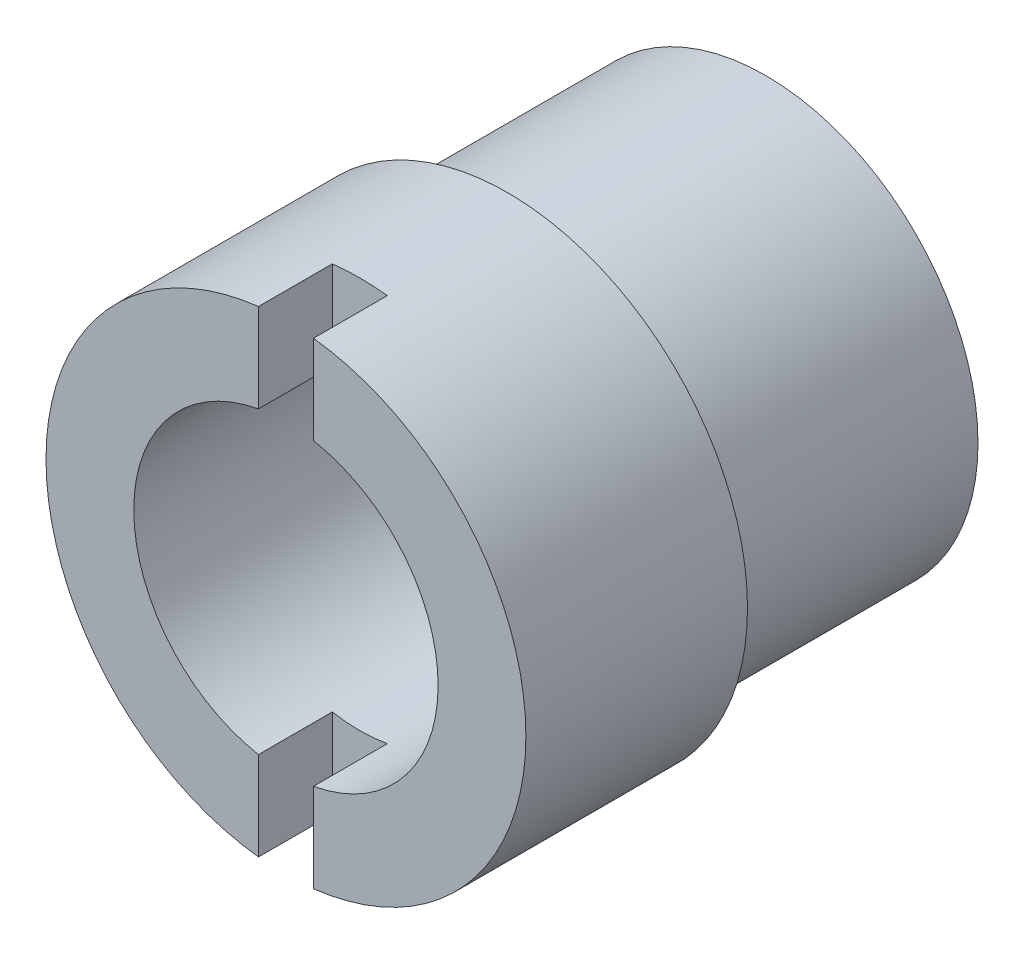
ISO-10303-21;
HEADER;
FILE_DESCRIPTION(('STEP AP214'),'2;1');
FILE_NAME('part.step','',(''),(''),'','','');
FILE_SCHEMA(('AUTOMOTIVE_DESIGN { 1 0 10303 214 1 1 1 1 }'));
ENDSEC;
DATA;
#1=APPLICATION_CONTEXT('core data for automotive mechanical design processes');
#2=APPLICATION_PROTOCOL_DEFINITION('international standard','automotive_design',2000,#1);
#3=PRODUCT_CONTEXT('',#1,'mechanical');
#4=PRODUCT('Part','Part','',(#3));
#5=PRODUCT_RELATED_PRODUCT_CATEGORY('part','',(#4));
#6=PRODUCT_DEFINITION_FORMATION('','',#4);
#7=PRODUCT_DEFINITION_CONTEXT('part definition',#1,'design');
#8=PRODUCT_DEFINITION('design','',#6,#7);
#9=PRODUCT_DEFINITION_SHAPE('','',#8);
#10=(LENGTH_UNIT() NAMED_UNIT(*) SI_UNIT(.MILLI.,.METRE.));
#11=(NAMED_UNIT(*) PLANE_ANGLE_UNIT() SI_UNIT($,.RADIAN.));
#12=(NAMED_UNIT(*) SI_UNIT($,.STERADIAN.) SOLID_ANGLE_UNIT());
#13=UNCERTAINTY_MEASURE_WITH_UNIT(LENGTH_MEASURE(1.E-05),#10,'distance_accuracy_value','');
#14=(GEOMETRIC_REPRESENTATION_CONTEXT(3) GLOBAL_UNCERTAINTY_ASSIGNED_CONTEXT((#13)) GLOBAL_UNIT_ASSIGNED_CONTEXT((#10,
#11,#12)) REPRESENTATION_CONTEXT('',''));
#15=CARTESIAN_POINT('',(0.,0.,0.));
#16=DIRECTION('',(0.,0.,1.));
#17=DIRECTION('',(1.,0.,0.));
#18=AXIS2_PLACEMENT_3D('',#15,#16,#17);
#19=CARTESIAN_POINT('',(0.,0.,9.525));
#20=DIRECTION('',(0.,0.,1.));
#21=DIRECTION('',(1.,0.,0.));
#22=AXIS2_PLACEMENT_3D('',#19,#20,#21);
#23=PLANE('',#22);
#24=DIRECTION('',(0.,1.,0.));
#25=VECTOR('',#24,1.);
#26=CARTESIAN_POINT('',(-1.1811,-10.3124,9.525));
#27=LINE('',#26,#25);
#28=CARTESIAN_POINT('',(-1.1811,6.43297311046766,9.525));
#29=VERTEX_POINT('',#28);
#30=CARTESIAN_POINT('',(-1.1811,10.2445398408128,9.525));
#31=VERTEX_POINT('',#30);
#32=EDGE_CURVE('E328',#29,#31,#27,.T.);
#33=ORIENTED_EDGE('',*,*,#32,.T.);
#34=CARTESIAN_POINT('',(0.,0.,9.525));
#35=DIRECTION('',(0.,0.,1.));
#36=DIRECTION('',(1.,0.,0.));
#37=AXIS2_PLACEMENT_3D('',#34,#35,#36);
#38=CIRCLE('',#37,10.3124);
#39=CARTESIAN_POINT('',(-1.1811,-10.2445398408128,9.525));
#40=VERTEX_POINT('',#39);
#41=EDGE_CURVE('E133',#31,#40,#38,.T.);
#42=ORIENTED_EDGE('',*,*,#41,.T.);
#43=CARTESIAN_POINT('',(-1.1811,-6.43297311046766,9.525));
#44=VERTEX_POINT('',#43);
#45=EDGE_CURVE('E326',#40,#44,#27,.T.);
#46=ORIENTED_EDGE('',*,*,#45,.T.);
#47=CARTESIAN_POINT('',(0.,0.,9.525));
#48=DIRECTION('',(0.,0.,1.));
#49=DIRECTION('',(1.,0.,0.));
#50=AXIS2_PLACEMENT_3D('',#47,#48,#49);
#51=CIRCLE('',#50,6.5405);
#52=EDGE_CURVE('E141',#29,#44,#51,.T.);
#53=ORIENTED_EDGE('',*,*,#52,.F.);
#54=EDGE_LOOP('',(#33,#42,#46,#53));
#55=FACE_BOUND('',#54,.T.);
#56=ADVANCED_FACE('F43',(#55),#23,.T.);
#57=DIRECTION('',(0.,1.,0.));
#58=VECTOR('',#57,1.);
#59=CARTESIAN_POINT('',(1.1811,-10.3124,9.525));
#60=LINE('',#59,#58);
#61=CARTESIAN_POINT('',(1.1811,-10.2445398408128,9.525));
#62=VERTEX_POINT('',#61);
#63=CARTESIAN_POINT('',(1.1811,-6.43297311046766,9.525));
#64=VERTEX_POINT('',#63);
#65=EDGE_CURVE('E67',#62,#64,#60,.T.);
#66=ORIENTED_EDGE('',*,*,#65,.F.);
#67=CARTESIAN_POINT('',(1.1811,10.2445398408128,9.525));
#68=VERTEX_POINT('',#67);
#69=EDGE_CURVE('E123',#62,#68,#38,.T.);
#70=ORIENTED_EDGE('',*,*,#69,.T.);
#71=CARTESIAN_POINT('',(1.1811,6.43297311046766,9.525));
#72=VERTEX_POINT('',#71);
#73=EDGE_CURVE('E127',#72,#68,#60,.T.);
#74=ORIENTED_EDGE('',*,*,#73,.F.);
#75=EDGE_CURVE('E125',#64,#72,#51,.T.);
#76=ORIENTED_EDGE('',*,*,#75,.F.);
#77=EDGE_LOOP('',(#66,#70,#74,#76));
#78=FACE_BOUND('',#77,.T.);
#79=ADVANCED_FACE('F121',(#78),#23,.T.);
#80=CARTESIAN_POINT('',(0.,0.,0.));
#81=DIRECTION('',(0.,0.,1.));
#82=DIRECTION('',(1.,0.,0.));
#83=AXIS2_PLACEMENT_3D('',#80,#81,#82);
#84=PLANE('',#83);
#85=CARTESIAN_POINT('',(0.,0.,0.));
#86=DIRECTION('',(0.,0.,-1.));
#87=DIRECTION('',(-1.,0.,0.));
#88=AXIS2_PLACEMENT_3D('',#85,#86,#87);
#89=CIRCLE('',#88,9.1186);
#90=CARTESIAN_POINT('',(-9.1186,0.,0.));
#91=VERTEX_POINT('',#90);
#92=EDGE_CURVE('E139',#91,#91,#89,.T.);
#93=ORIENTED_EDGE('',*,*,#92,.F.);
#94=EDGE_LOOP('',(#93));
#95=FACE_BOUND('',#94,.T.);
#96=CARTESIAN_POINT('',(0.,0.,0.));
#97=DIRECTION('',(0.,0.,1.));
#98=DIRECTION('',(1.,0.,0.));
#99=AXIS2_PLACEMENT_3D('',#96,#97,#98);
#100=CIRCLE('',#99,10.3124);
#101=CARTESIAN_POINT('',(10.3124,0.,0.));
#102=VERTEX_POINT('',#101);
#103=EDGE_CURVE('E134',#102,#102,#100,.T.);
#104=ORIENTED_EDGE('',*,*,#103,.F.);
#105=EDGE_LOOP('',(#104));
#106=FACE_BOUND('',#105,.T.);
#107=ADVANCED_FACE('F203',(#95,#106),#84,.F.);
#108=CARTESIAN_POINT('',(0.,0.,9.525));
#109=DIRECTION('',(0.,0.,-1.));
#110=DIRECTION('',(-1.,0.,0.));
#111=AXIS2_PLACEMENT_3D('',#108,#109,#110);
#112=CYLINDRICAL_SURFACE('',#111,10.3124);
#113=ORIENTED_EDGE('',*,*,#41,.F.);
#114=DIRECTION('',(0.,0.,-1.));
#115=VECTOR('',#114,1.);
#116=CARTESIAN_POINT('',(-1.1811,10.2445398408128,9.525));
#117=LINE('',#116,#115);
#118=CARTESIAN_POINT('',(-1.1811,10.2445398408128,6.35));
#119=VERTEX_POINT('',#118);
#120=EDGE_CURVE('E194',#31,#119,#117,.T.);
#121=ORIENTED_EDGE('',*,*,#120,.T.);
#122=CARTESIAN_POINT('',(0.,0.,6.35));
#123=DIRECTION('',(0.,0.,-1.));
#124=DIRECTION('',(-1.,0.,0.));
#125=AXIS2_PLACEMENT_3D('',#122,#123,#124);
#126=CIRCLE('',#125,10.3124);
#127=CARTESIAN_POINT('',(1.1811,10.2445398408128,6.35));
#128=VERTEX_POINT('',#127);
#129=EDGE_CURVE('E322',#119,#128,#126,.T.);
#130=ORIENTED_EDGE('',*,*,#129,.T.);
#131=DIRECTION('',(0.,0.,-1.));
#132=VECTOR('',#131,1.);
#133=CARTESIAN_POINT('',(1.1811,10.2445398408128,9.525));
#134=LINE('',#133,#132);
#135=EDGE_CURVE('E116',#128,#68,#134,.F.);
#136=ORIENTED_EDGE('',*,*,#135,.T.);
#137=ORIENTED_EDGE('',*,*,#69,.F.);
#138=DIRECTION('',(0.,0.,-1.));
#139=VECTOR('',#138,1.);
#140=CARTESIAN_POINT('',(1.1811,-10.2445398408128,9.525));
#141=LINE('',#140,#139);
#142=CARTESIAN_POINT('',(1.1811,-10.2445398408128,6.35));
#143=VERTEX_POINT('',#142);
#144=EDGE_CURVE('E108',#62,#143,#141,.T.);
#145=ORIENTED_EDGE('',*,*,#144,.T.);
#146=CARTESIAN_POINT('',(-1.1811,-10.2445398408128,6.35));
#147=VERTEX_POINT('',#146);
#148=EDGE_CURVE('E115',#143,#147,#126,.T.);
#149=ORIENTED_EDGE('',*,*,#148,.T.);
#150=DIRECTION('',(0.,0.,-1.));
#151=VECTOR('',#150,1.);
#152=CARTESIAN_POINT('',(-1.1811,-10.2445398408128,9.525));
#153=LINE('',#152,#151);
#154=EDGE_CURVE('E170',#147,#40,#153,.F.);
#155=ORIENTED_EDGE('',*,*,#154,.T.);
#156=EDGE_LOOP('',(#113,#121,#130,#136,#137,#145,#149,#155));
#157=FACE_BOUND('',#156,.T.);
#158=ORIENTED_EDGE('',*,*,#103,.T.);
#159=EDGE_LOOP('',(#158));
#160=FACE_BOUND('',#159,.T.);
#161=ADVANCED_FACE('F45',(#157,#160),#112,.T.);
#162=CARTESIAN_POINT('',(0.,0.,9.525));
#163=DIRECTION('',(0.,0.,-1.));
#164=DIRECTION('',(-1.,0.,0.));
#165=AXIS2_PLACEMENT_3D('',#162,#163,#164);
#166=CYLINDRICAL_SURFACE('',#165,6.5405);
#167=DIRECTION('',(0.,0.,-1.));
#168=VECTOR('',#167,1.);
#169=CARTESIAN_POINT('',(-1.1811,-6.43297311046766,9.525));
#170=LINE('',#169,#168);
#171=CARTESIAN_POINT('',(-1.1811,-6.43297311046766,6.35));
#172=VERTEX_POINT('',#171);
#173=EDGE_CURVE('E11',#172,#44,#170,.F.);
#174=ORIENTED_EDGE('',*,*,#173,.F.);
#175=CARTESIAN_POINT('',(0.,0.,6.35));
#176=DIRECTION('',(0.,0.,-1.));
#177=DIRECTION('',(-1.,0.,0.));
#178=AXIS2_PLACEMENT_3D('',#175,#176,#177);
#179=CIRCLE('',#178,6.5405);
#180=CARTESIAN_POINT('',(1.1811,-6.43297311046766,6.35));
#181=VERTEX_POINT('',#180);
#182=EDGE_CURVE('E52',#181,#172,#179,.T.);
#183=ORIENTED_EDGE('',*,*,#182,.F.);
#184=DIRECTION('',(0.,0.,-1.));
#185=VECTOR('',#184,1.);
#186=CARTESIAN_POINT('',(1.1811,-6.43297311046766,9.525));
#187=LINE('',#186,#185);
#188=EDGE_CURVE('E154',#64,#181,#187,.T.);
#189=ORIENTED_EDGE('',*,*,#188,.F.);
#190=ORIENTED_EDGE('',*,*,#75,.T.);
#191=DIRECTION('',(0.,0.,-1.));
#192=VECTOR('',#191,1.);
#193=CARTESIAN_POINT('',(1.1811,6.43297311046766,9.525));
#194=LINE('',#193,#192);
#195=CARTESIAN_POINT('',(1.1811,6.43297311046766,6.35));
#196=VERTEX_POINT('',#195);
#197=EDGE_CURVE('E146',#196,#72,#194,.F.);
#198=ORIENTED_EDGE('',*,*,#197,.F.);
#199=CARTESIAN_POINT('',(-1.1811,6.43297311046766,6.35));
#200=VERTEX_POINT('',#199);
#201=EDGE_CURVE('E149',#200,#196,#179,.T.);
#202=ORIENTED_EDGE('',*,*,#201,.F.);
#203=DIRECTION('',(0.,0.,-1.));
#204=VECTOR('',#203,1.);
#205=CARTESIAN_POINT('',(-1.1811,6.43297311046766,9.525));
#206=LINE('',#205,#204);
#207=EDGE_CURVE('E152',#29,#200,#206,.T.);
#208=ORIENTED_EDGE('',*,*,#207,.F.);
#209=ORIENTED_EDGE('',*,*,#52,.T.);
#210=EDGE_LOOP('',(#174,#183,#189,#190,#198,#202,#208,#209));
#211=FACE_BOUND('',#210,.T.);
#212=CARTESIAN_POINT('',(0.,0.,-11.0998));
#213=DIRECTION('',(0.,0.,-1.));
#214=DIRECTION('',(-1.,0.,0.));
#215=AXIS2_PLACEMENT_3D('',#212,#213,#214);
#216=CIRCLE('',#215,6.5405);
#217=CARTESIAN_POINT('',(-6.5405,0.,-11.0998));
#218=VERTEX_POINT('',#217);
#219=EDGE_CURVE('E188',#218,#218,#216,.F.);
#220=ORIENTED_EDGE('',*,*,#219,.F.);
#221=EDGE_LOOP('',(#220));
#222=FACE_BOUND('',#221,.T.);
#223=ADVANCED_FACE('F175',(#211,#222),#166,.F.);
#224=CARTESIAN_POINT('',(0.,0.,-11.0998));
#225=DIRECTION('',(0.,0.,1.));
#226=DIRECTION('',(1.,0.,0.));
#227=AXIS2_PLACEMENT_3D('',#224,#225,#226);
#228=CYLINDRICAL_SURFACE('',#227,9.1186);
#229=CARTESIAN_POINT('',(0.,0.,-11.0998));
#230=DIRECTION('',(0.,0.,-1.));
#231=DIRECTION('',(-1.,0.,0.));
#232=AXIS2_PLACEMENT_3D('',#229,#230,#231);
#233=CIRCLE('',#232,9.1186);
#234=CARTESIAN_POINT('',(-9.1186,0.,-11.0998));
#235=VERTEX_POINT('',#234);
#236=EDGE_CURVE('E184',#235,#235,#233,.T.);
#237=ORIENTED_EDGE('',*,*,#236,.F.);
#238=EDGE_LOOP('',(#237));
#239=FACE_BOUND('',#238,.T.);
#240=ORIENTED_EDGE('',*,*,#92,.T.);
#241=EDGE_LOOP('',(#240));
#242=FACE_BOUND('',#241,.T.);
#243=ADVANCED_FACE('F201',(#239,#242),#228,.T.);
#244=CARTESIAN_POINT('',(0.,0.,-11.0998));
#245=DIRECTION('',(0.,0.,-1.));
#246=DIRECTION('',(-1.,0.,0.));
#247=AXIS2_PLACEMENT_3D('',#244,#245,#246);
#248=PLANE('',#247);
#249=ORIENTED_EDGE('',*,*,#219,.T.);
#250=EDGE_LOOP('',(#249));
#251=FACE_BOUND('',#250,.T.);
#252=ORIENTED_EDGE('',*,*,#236,.T.);
#253=EDGE_LOOP('',(#252));
#254=FACE_BOUND('',#253,.T.);
#255=ADVANCED_FACE('F220',(#251,#254),#248,.T.);
#256=CARTESIAN_POINT('',(1.1811,-10.3124,9.525));
#257=DIRECTION('',(1.,0.,0.));
#258=DIRECTION('',(0.,0.,-1.));
#259=AXIS2_PLACEMENT_3D('',#256,#257,#258);
#260=PLANE('',#259);
#261=DIRECTION('',(0.,1.,0.));
#262=VECTOR('',#261,1.);
#263=CARTESIAN_POINT('',(1.1811,-10.3124,6.35));
#264=LINE('',#263,#262);
#265=EDGE_CURVE('E59',#196,#128,#264,.T.);
#266=ORIENTED_EDGE('',*,*,#265,.F.);
#267=ORIENTED_EDGE('',*,*,#197,.T.);
#268=ORIENTED_EDGE('',*,*,#73,.T.);
#269=ORIENTED_EDGE('',*,*,#135,.F.);
#270=EDGE_LOOP('',(#266,#267,#268,#269));
#271=FACE_BOUND('',#270,.T.);
#272=ADVANCED_FACE('F224',(#271),#260,.F.);
#273=CARTESIAN_POINT('',(-1.1811,-10.3124,6.35));
#274=DIRECTION('',(0.,0.,-1.));
#275=DIRECTION('',(-1.,0.,0.));
#276=AXIS2_PLACEMENT_3D('',#273,#274,#275);
#277=PLANE('',#276);
#278=DIRECTION('',(0.,1.,0.));
#279=VECTOR('',#278,1.);
#280=CARTESIAN_POINT('',(-1.1811,-10.3124,6.35));
#281=LINE('',#280,#279);
#282=EDGE_CURVE('E172',#200,#119,#281,.T.);
#283=ORIENTED_EDGE('',*,*,#282,.F.);
#284=ORIENTED_EDGE('',*,*,#201,.T.);
#285=ORIENTED_EDGE('',*,*,#265,.T.);
#286=ORIENTED_EDGE('',*,*,#129,.F.);
#287=EDGE_LOOP('',(#283,#284,#285,#286));
#288=FACE_BOUND('',#287,.T.);
#289=ADVANCED_FACE('F229',(#288),#277,.F.);
#290=CARTESIAN_POINT('',(-1.1811,-10.3124,9.525));
#291=DIRECTION('',(-1.,0.,0.));
#292=DIRECTION('',(0.,0.,1.));
#293=AXIS2_PLACEMENT_3D('',#290,#291,#292);
#294=PLANE('',#293);
#295=ORIENTED_EDGE('',*,*,#32,.F.);
#296=ORIENTED_EDGE('',*,*,#207,.T.);
#297=ORIENTED_EDGE('',*,*,#282,.T.);
#298=ORIENTED_EDGE('',*,*,#120,.F.);
#299=EDGE_LOOP('',(#295,#296,#297,#298));
#300=FACE_BOUND('',#299,.T.);
#301=ADVANCED_FACE('F226',(#300),#294,.F.);
#302=EDGE_CURVE('E162',#147,#172,#281,.T.);
#303=ORIENTED_EDGE('',*,*,#302,.T.);
#304=ORIENTED_EDGE('',*,*,#173,.T.);
#305=ORIENTED_EDGE('',*,*,#45,.F.);
#306=ORIENTED_EDGE('',*,*,#154,.F.);
#307=EDGE_LOOP('',(#303,#304,#305,#306));
#308=FACE_BOUND('',#307,.T.);
#309=ADVANCED_FACE('F167',(#308),#294,.F.);
#310=EDGE_CURVE('E111',#143,#181,#264,.T.);
#311=ORIENTED_EDGE('',*,*,#310,.T.);
#312=ORIENTED_EDGE('',*,*,#182,.T.);
#313=ORIENTED_EDGE('',*,*,#302,.F.);
#314=ORIENTED_EDGE('',*,*,#148,.F.);
#315=EDGE_LOOP('',(#311,#312,#313,#314));
#316=FACE_BOUND('',#315,.T.);
#317=ADVANCED_FACE('F161',(#316),#277,.F.);
#318=ORIENTED_EDGE('',*,*,#65,.T.);
#319=ORIENTED_EDGE('',*,*,#188,.T.);
#320=ORIENTED_EDGE('',*,*,#310,.F.);
#321=ORIENTED_EDGE('',*,*,#144,.F.);
#322=EDGE_LOOP('',(#318,#319,#320,#321));
#323=FACE_BOUND('',#322,.T.);
#324=ADVANCED_FACE('F109',(#323),#260,.F.);
#325=CLOSED_SHELL('',(#56,#79,#107,#161,#223,#243,#255,#272,#289,#301,#309,#317,#324));
#326=MANIFOLD_SOLID_BREP('B2',#325);
#327=ADVANCED_BREP_SHAPE_REPRESENTATION('',(#18,#326),#14);
#328=SHAPE_DEFINITION_REPRESENTATION(#9,#327);
ENDSEC;
END-ISO-10303-21;
